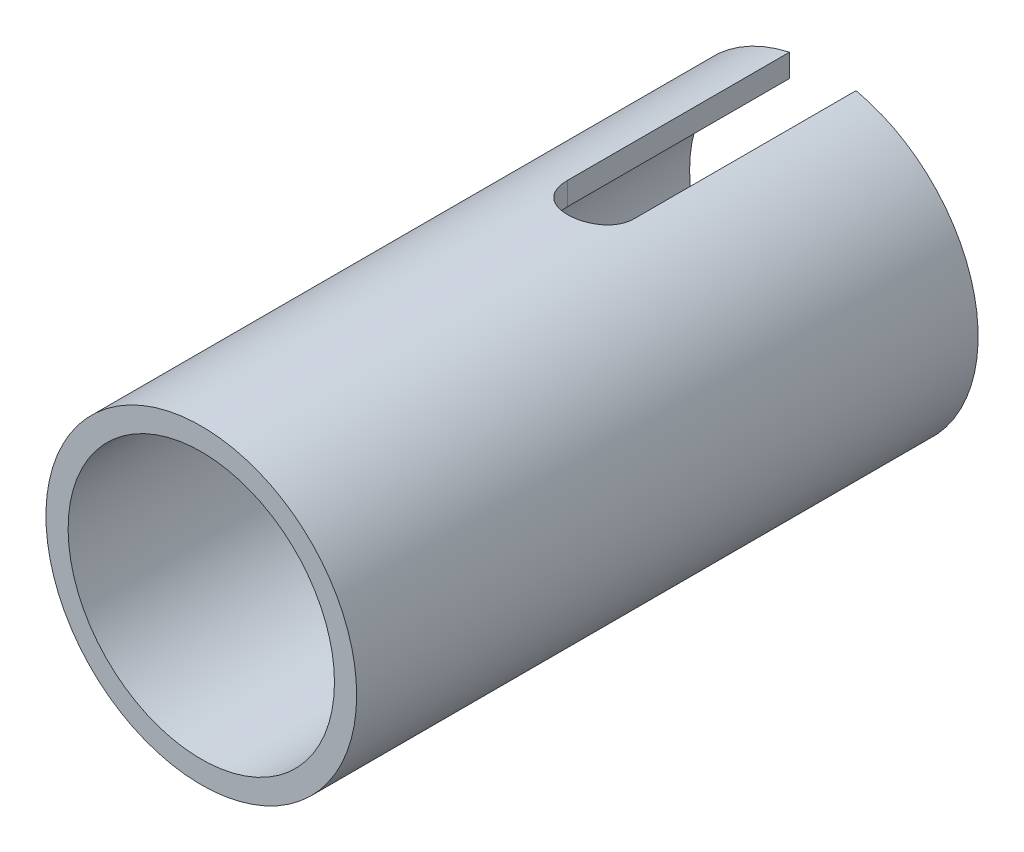
ISO-10303-21;
HEADER;
FILE_DESCRIPTION(('STEP AP214'),'2;1');
FILE_NAME('part.step','',(''),(''),'','','');
FILE_SCHEMA(('AUTOMOTIVE_DESIGN { 1 0 10303 214 1 1 1 1 }'));
ENDSEC;
DATA;
#1=APPLICATION_CONTEXT('core data for automotive mechanical design processes');
#2=APPLICATION_PROTOCOL_DEFINITION('international standard','automotive_design',2000,#1);
#3=PRODUCT_CONTEXT('',#1,'mechanical');
#4=PRODUCT('Part','Part','',(#3));
#5=PRODUCT_RELATED_PRODUCT_CATEGORY('part','',(#4));
#6=PRODUCT_DEFINITION_FORMATION('','',#4);
#7=PRODUCT_DEFINITION_CONTEXT('part definition',#1,'design');
#8=PRODUCT_DEFINITION('design','',#6,#7);
#9=PRODUCT_DEFINITION_SHAPE('','',#8);
#10=(LENGTH_UNIT() NAMED_UNIT(*) SI_UNIT(.MILLI.,.METRE.));
#11=(NAMED_UNIT(*) PLANE_ANGLE_UNIT() SI_UNIT($,.RADIAN.));
#12=(NAMED_UNIT(*) SI_UNIT($,.STERADIAN.) SOLID_ANGLE_UNIT());
#13=UNCERTAINTY_MEASURE_WITH_UNIT(LENGTH_MEASURE(1.E-05),#10,'distance_accuracy_value','');
#14=(GEOMETRIC_REPRESENTATION_CONTEXT(3) GLOBAL_UNCERTAINTY_ASSIGNED_CONTEXT((#13)) GLOBAL_UNIT_ASSIGNED_CONTEXT((#10,
#11,#12)) REPRESENTATION_CONTEXT('',''));
#15=CARTESIAN_POINT('',(0.,0.,0.));
#16=DIRECTION('',(0.,0.,1.));
#17=DIRECTION('',(1.,0.,0.));
#18=AXIS2_PLACEMENT_3D('',#15,#16,#17);
#19=CARTESIAN_POINT('',(0.,0.,-14.));
#20=DIRECTION('',(0.,0.,1.));
#21=DIRECTION('',(1.,0.,0.));
#22=AXIS2_PLACEMENT_3D('',#19,#20,#21);
#23=PLANE('',#22);
#24=DIRECTION('',(0.,1.,0.));
#25=VECTOR('',#24,1.);
#26=CARTESIAN_POINT('',(-1.5,0.,-14.));
#27=LINE('',#26,#25);
#28=CARTESIAN_POINT('',(-1.5,5.80947501931113,-14.));
#29=VERTEX_POINT('',#28);
#30=CARTESIAN_POINT('',(-1.5,6.83739716558867,-14.));
#31=VERTEX_POINT('',#30);
#32=EDGE_CURVE('E57',#29,#31,#27,.T.);
#33=ORIENTED_EDGE('',*,*,#32,.F.);
#34=CARTESIAN_POINT('',(0.,0.,-14.));
#35=DIRECTION('',(0.,0.,1.));
#36=DIRECTION('',(1.,0.,0.));
#37=AXIS2_PLACEMENT_3D('',#34,#35,#36);
#38=CIRCLE('',#37,6.);
#39=CARTESIAN_POINT('',(1.5,5.80947501931113,-14.));
#40=VERTEX_POINT('',#39);
#41=EDGE_CURVE('E88',#29,#40,#38,.T.);
#42=ORIENTED_EDGE('',*,*,#41,.T.);
#43=DIRECTION('',(0.,1.,0.));
#44=VECTOR('',#43,1.);
#45=CARTESIAN_POINT('',(1.5,0.,-14.));
#46=LINE('',#45,#44);
#47=CARTESIAN_POINT('',(1.5,6.83739716558867,-14.));
#48=VERTEX_POINT('',#47);
#49=EDGE_CURVE('E49',#40,#48,#46,.T.);
#50=ORIENTED_EDGE('',*,*,#49,.T.);
#51=CARTESIAN_POINT('',(0.,0.,-14.));
#52=DIRECTION('',(0.,0.,1.));
#53=DIRECTION('',(1.,0.,0.));
#54=AXIS2_PLACEMENT_3D('',#51,#52,#53);
#55=CIRCLE('',#54,7.);
#56=EDGE_CURVE('E86',#31,#48,#55,.T.);
#57=ORIENTED_EDGE('',*,*,#56,.F.);
#58=EDGE_LOOP('',(#33,#42,#50,#57));
#59=FACE_BOUND('',#58,.T.);
#60=ADVANCED_FACE('F33',(#59),#23,.F.);
#61=CARTESIAN_POINT('',(0.,0.,14.));
#62=DIRECTION('',(0.,0.,-1.));
#63=DIRECTION('',(-1.,0.,0.));
#64=AXIS2_PLACEMENT_3D('',#61,#62,#63);
#65=CYLINDRICAL_SURFACE('',#64,7.);
#66=CARTESIAN_POINT('',(0.,0.,14.));
#67=DIRECTION('',(0.,0.,1.));
#68=DIRECTION('',(1.,0.,0.));
#69=AXIS2_PLACEMENT_3D('',#66,#67,#68);
#70=CIRCLE('',#69,7.);
#71=CARTESIAN_POINT('',(7.,0.,14.));
#72=VERTEX_POINT('',#71);
#73=EDGE_CURVE('E91',#72,#72,#70,.T.);
#74=ORIENTED_EDGE('',*,*,#73,.F.);
#75=EDGE_LOOP('',(#74));
#76=FACE_BOUND('',#75,.T.);
#77=DIRECTION('',(0.,0.,-1.));
#78=VECTOR('',#77,1.);
#79=CARTESIAN_POINT('',(-1.5,6.83739716558867,14.));
#80=LINE('',#79,#78);
#81=CARTESIAN_POINT('',(-1.5,6.83739716558867,-4.));
#82=VERTEX_POINT('',#81);
#83=EDGE_CURVE('E90',#31,#82,#80,.F.);
#84=ORIENTED_EDGE('',*,*,#83,.F.);
#85=ORIENTED_EDGE('',*,*,#56,.T.);
#86=DIRECTION('',(0.,0.,-1.));
#87=VECTOR('',#86,1.);
#88=CARTESIAN_POINT('',(1.5,6.83739716558867,14.));
#89=LINE('',#88,#87);
#90=CARTESIAN_POINT('',(1.5,6.83739716558867,-4.));
#91=VERTEX_POINT('',#90);
#92=EDGE_CURVE('E74',#91,#48,#89,.T.);
#93=ORIENTED_EDGE('',*,*,#92,.F.);
#94=CARTESIAN_POINT('',(-1.5,6.83739716558867,-4.));
#95=CARTESIAN_POINT('',(-1.50000029732089,6.83739484329566,-3.95831678523298));
#96=CARTESIAN_POINT('',(-1.49826140658071,6.83777882435591,-3.91665403131256));
#97=CARTESIAN_POINT('',(-1.49132805084357,6.83929523701274,-3.8336363859717));
#98=CARTESIAN_POINT('',(-1.48613405334026,6.84042756735369,-3.79228145366679));
#99=CARTESIAN_POINT('',(-1.46543780681055,6.84490346593298,-3.66926930285053));
#100=CARTESIAN_POINT('',(-1.44482103342029,6.84932618278863,-3.58845147370675));
#101=CARTESIAN_POINT('',(-1.3905903999887,6.86054041036668,-3.4315270956149));
#102=CARTESIAN_POINT('',(-1.35697579844481,6.86733205623004,-3.3554208157396));
#103=CARTESIAN_POINT('',(-1.27773441574604,6.88251529148972,-3.20990079292933));
#104=CARTESIAN_POINT('',(-1.23210586634308,6.8909071163549,-3.14048803722327));
#105=CARTESIAN_POINT('',(-1.12935344969147,6.90849541544179,-3.00923864207543));
#106=CARTESIAN_POINT('',(-1.07207318514053,6.91770175451983,-2.94752579909368));
#107=CARTESIAN_POINT('',(-0.947974889192731,6.93579620720272,-2.8345008517585));
#108=CARTESIAN_POINT('',(-0.881155372688937,6.94468427098724,-2.78319036989993));
#109=CARTESIAN_POINT('',(-0.73904538052824,6.96124791167855,-2.69194325606053));
#110=CARTESIAN_POINT('',(-0.663676469106146,6.96891039531078,-2.65212620350719));
#111=CARTESIAN_POINT('',(-0.507129946630226,6.98204700344864,-2.58577091325486));
#112=CARTESIAN_POINT('',(-0.42595327127146,6.98752147953465,-2.55923054201752));
#113=CARTESIAN_POINT('',(-0.26138812941414,6.99559560634851,-2.52057024531131));
#114=CARTESIAN_POINT('',(-0.178051320316187,6.99823727344862,-2.50823935268556));
#115=CARTESIAN_POINT('',(-0.0104508848040283,7.00049363043298,-2.49768868443079));
#116=CARTESIAN_POINT('',(0.0738126602900054,7.00010858382522,-2.49946768038424));
#117=CARTESIAN_POINT('',(0.239417349879403,6.99638700149173,-2.51692899635186));
#118=CARTESIAN_POINT('',(0.32078374895878,6.99309880565581,-2.53238361513316));
#119=CARTESIAN_POINT('',(0.479740067564263,6.98399537089511,-2.57639490956332));
#120=CARTESIAN_POINT('',(0.55732985009482,6.9781800403752,-2.6049520601111));
#121=CARTESIAN_POINT('',(0.707168618927708,6.96459744432429,-2.67456195856455));
#122=CARTESIAN_POINT('',(0.779375811917164,6.95681662412837,-2.71570191500216));
#123=CARTESIAN_POINT('',(0.915942860799011,6.94015767254516,-2.80924362130109));
#124=CARTESIAN_POINT('',(0.980301920885987,6.93127943006207,-2.86164651174485));
#125=CARTESIAN_POINT('',(1.10069448348731,6.91319440083952,-2.97746092851556));
#126=CARTESIAN_POINT('',(1.15653715948799,6.90398459117831,-3.04107049675332));
#127=CARTESIAN_POINT('',(1.25681135832715,6.88643777134492,-3.1768663924243));
#128=CARTESIAN_POINT('',(1.30123974690007,6.87810100127342,-3.24905506766507));
#129=CARTESIAN_POINT('',(1.3775062481421,6.86323517651743,-3.40027102726539));
#130=CARTESIAN_POINT('',(1.40930236263766,6.85671217322863,-3.47932007632602));
#131=CARTESIAN_POINT('',(1.45906006728709,6.84629833307981,-3.64176182224441));
#132=CARTESIAN_POINT('',(1.47704225884158,6.8424035776398,-3.72514785205492));
#133=CARTESIAN_POINT('',(1.49189329044742,6.83917134563156,-3.84101322067716));
#134=CARTESIAN_POINT('',(1.4949342344042,6.83850683250701,-3.87275828161377));
#135=CARTESIAN_POINT('',(1.49898510369339,6.83762006876856,-3.93633072166705));
#136=CARTESIAN_POINT('',(1.49999840895604,6.83739708216771,-3.96815787509443));
#137=CARTESIAN_POINT('',(1.5,6.83739716558867,-4.));
#138=B_SPLINE_CURVE_WITH_KNOTS('',3,(#94,#95,#96,#97,#98,#99,#100,#101,#102,#103,#104,#105,#106,
#107,#108,#109,#110,#111,#112,#113,#114,#115,#116,#117,#118,#119,#120,#121,#122,#123,#124,#125,
#126,#127,#128,#129,#130,#131,#132,#133,#134,#135,#136,#137),.UNSPECIFIED.,.F.,.F.,(4,2,2,2,2,2,
2,2,2,2,2,2,2,2,2,2,2,2,2,2,2,4),(0.,0.124971263763367,0.249925621712149,0.499202862460446,
0.748494326122781,0.997822501764374,1.25074899410904,1.5037149060375,1.75922495548826,
2.01469393174161,2.26631902059305,2.51792220301497,2.76541336165448,3.01291349127569,
3.26216942567437,3.51145061379527,3.76568473601693,4.01998859431662,4.27513099287042,
4.52989214199009,4.6255313484217,4.72101099781213),.UNSPECIFIED.);
#139=EDGE_CURVE('E81',#82,#91,#138,.T.);
#140=ORIENTED_EDGE('',*,*,#139,.F.);
#141=EDGE_LOOP('',(#84,#85,#93,#140));
#142=FACE_BOUND('',#141,.T.);
#143=ADVANCED_FACE('F35',(#76,#142),#65,.T.);
#144=CARTESIAN_POINT('',(0.,0.,14.));
#145=DIRECTION('',(0.,0.,-1.));
#146=DIRECTION('',(-1.,0.,0.));
#147=AXIS2_PLACEMENT_3D('',#144,#145,#146);
#148=CYLINDRICAL_SURFACE('',#147,6.);
#149=CARTESIAN_POINT('',(0.,0.,14.));
#150=DIRECTION('',(0.,0.,1.));
#151=DIRECTION('',(1.,0.,0.));
#152=AXIS2_PLACEMENT_3D('',#149,#150,#151);
#153=CIRCLE('',#152,6.);
#154=CARTESIAN_POINT('',(6.,0.,14.));
#155=VERTEX_POINT('',#154);
#156=EDGE_CURVE('E92',#155,#155,#153,.T.);
#157=ORIENTED_EDGE('',*,*,#156,.T.);
#158=EDGE_LOOP('',(#157));
#159=FACE_BOUND('',#158,.T.);
#160=ORIENTED_EDGE('',*,*,#41,.F.);
#161=DIRECTION('',(0.,0.,-1.));
#162=VECTOR('',#161,1.);
#163=CARTESIAN_POINT('',(-1.5,5.80947501931113,14.));
#164=LINE('',#163,#162);
#165=CARTESIAN_POINT('',(-1.5,5.80947501931113,-4.));
#166=VERTEX_POINT('',#165);
#167=EDGE_CURVE('E11',#29,#166,#164,.F.);
#168=ORIENTED_EDGE('',*,*,#167,.T.);
#169=CARTESIAN_POINT('',(-1.5,5.80947501931113,-4.));
#170=CARTESIAN_POINT('',(-1.50000050624417,5.80947222870266,-3.95850552234019));
#171=CARTESIAN_POINT('',(-1.49827711106305,5.80992014924206,-3.91703160547266));
#172=CARTESIAN_POINT('',(-1.49140694309363,5.81168857161838,-3.83439394704465));
#173=CARTESIAN_POINT('',(-1.48626074635902,5.81300892662531,-3.79323015446936));
#174=CARTESIAN_POINT('',(-1.46576285907379,5.81822566458081,-3.67082024018673));
#175=CARTESIAN_POINT('',(-1.44535154275874,5.82337804723213,-3.59041529727669));
#176=CARTESIAN_POINT('',(-1.39169711437199,5.83643133882004,-3.43431298932705));
#177=CARTESIAN_POINT('',(-1.35845520813575,5.84433198946395,-3.35861518268071));
#178=CARTESIAN_POINT('',(-1.2801230670388,5.86198701707909,-3.21383282702901));
#179=CARTESIAN_POINT('',(-1.2350296550354,5.87174189093471,-3.14475005816355));
#180=CARTESIAN_POINT('',(-1.1332267077421,5.89224393597038,-3.01368417714085));
#181=CARTESIAN_POINT('',(-1.07630590317596,5.90300686543374,-2.95186767063172));
#182=CARTESIAN_POINT('',(-0.952913670774344,5.9241765659429,-2.83854686577594));
#183=CARTESIAN_POINT('',(-0.886440719218246,5.93458327983806,-2.78704421579809));
#184=CARTESIAN_POINT('',(-0.744685349102535,5.95404273424873,-2.69513349757203));
#185=CARTESIAN_POINT('',(-0.66929301050171,5.96307457022595,-2.65489015602404));
#186=CARTESIAN_POINT('',(-0.512553886264378,5.97858519375883,-2.58771289870494));
#187=CARTESIAN_POINT('',(-0.431208276124515,5.98506448372051,-2.56077636355025));
#188=CARTESIAN_POINT('',(-0.26661616278774,5.99462850007692,-2.52151151083385));
#189=CARTESIAN_POINT('',(-0.183441483004287,5.99777929351951,-2.50889849136577));
#190=CARTESIAN_POINT('',(-0.0160991635225196,6.00056157226223,-2.49774494268506));
#191=CARTESIAN_POINT('',(0.0680683500430581,6.00019349990167,-2.49920264471149));
#192=CARTESIAN_POINT('',(0.233028739458144,5.99602856048604,-2.51594494552818));
#193=CARTESIAN_POINT('',(0.313855052609782,5.99230798016041,-2.53092192489922));
#194=CARTESIAN_POINT('',(0.471808066626509,5.98194495954744,-2.57378301877412));
#195=CARTESIAN_POINT('',(0.548934603635981,5.97530238998334,-2.60166770435287));
#196=CARTESIAN_POINT('',(0.698110929036808,5.95972496642698,-2.66980192100598));
#197=CARTESIAN_POINT('',(0.770108444403371,5.95076990741333,-2.71016109134926));
#198=CARTESIAN_POINT('',(0.90641494684502,5.93153918312879,-2.8020146947502));
#199=CARTESIAN_POINT('',(0.970722773343432,5.92126331899798,-2.85351080537983));
#200=CARTESIAN_POINT('',(1.09165408456273,5.90018349034298,-2.96781836812197));
#201=CARTESIAN_POINT('',(1.14802365458119,5.88937275716528,-3.03089745480972));
#202=CARTESIAN_POINT('',(1.24945436277935,5.8686925242601,-3.1657448003916));
#203=CARTESIAN_POINT('',(1.29451240536759,5.8588232826449,-3.23751542992534));
#204=CARTESIAN_POINT('',(1.37220706392894,5.84111720379488,-3.38821839673565));
#205=CARTESIAN_POINT('',(1.4047755268309,5.83329159013705,-3.46718719734413));
#206=CARTESIAN_POINT('',(1.45605352777474,5.82070588210583,-3.62967539262743));
#207=CARTESIAN_POINT('',(1.4747837838182,5.81594120642153,-3.71318778272476));
#208=CARTESIAN_POINT('',(1.49085695272641,5.81182936022287,-3.83118607113835));
#209=CARTESIAN_POINT('',(1.49428618645006,5.8109478466629,-3.86487955481977));
#210=CARTESIAN_POINT('',(1.49885513654609,5.80977093733462,-3.93237668486398));
#211=CARTESIAN_POINT('',(1.49999855714407,5.80947459329192,-3.96618006393294));
#212=CARTESIAN_POINT('',(1.5,5.80947501931113,-4.));
#213=B_SPLINE_CURVE_WITH_KNOTS('',3,(#169,#170,#171,#172,#173,#174,#175,#176,#177,#178,#179,
#180,#181,#182,#183,#184,#185,#186,#187,#188,#189,#190,#191,#192,#193,#194,#195,#196,#197,#198,
#199,#200,#201,#202,#203,#204,#205,#206,#207,#208,#209,#210,#211,#212),.UNSPECIFIED.,.F.,.F.,(4,
2,2,2,2,2,2,2,2,2,2,2,2,2,2,2,2,2,2,2,2,4),(0.,0.124404795509654,0.248788659126977,
0.496844944620475,0.744877923137247,0.992977462090123,1.24596284614196,1.49898863030879,
1.75554280647352,2.01204646098636,2.26335722272987,2.51463639384958,2.76033818218913,
3.00605084213757,3.25398764175564,3.50196181446493,3.75662144301813,4.0113506877145,
4.26745080241601,4.52316671309978,4.62473773083971,4.72614401597506),.UNSPECIFIED.);
#214=CARTESIAN_POINT('',(1.5,5.80947501931113,-4.));
#215=VERTEX_POINT('',#214);
#216=EDGE_CURVE('E42',#166,#215,#213,.T.);
#217=ORIENTED_EDGE('',*,*,#216,.T.);
#218=DIRECTION('',(0.,0.,-1.));
#219=VECTOR('',#218,1.);
#220=CARTESIAN_POINT('',(1.5,5.80947501931113,14.));
#221=LINE('',#220,#219);
#222=EDGE_CURVE('E95',#215,#40,#221,.T.);
#223=ORIENTED_EDGE('',*,*,#222,.T.);
#224=EDGE_LOOP('',(#160,#168,#217,#223));
#225=FACE_BOUND('',#224,.T.);
#226=ADVANCED_FACE('F107',(#159,#225),#148,.F.);
#227=CARTESIAN_POINT('',(0.,0.,14.));
#228=DIRECTION('',(0.,0.,1.));
#229=DIRECTION('',(1.,0.,0.));
#230=AXIS2_PLACEMENT_3D('',#227,#228,#229);
#231=PLANE('',#230);
#232=ORIENTED_EDGE('',*,*,#73,.T.);
#233=EDGE_LOOP('',(#232));
#234=FACE_BOUND('',#233,.T.);
#235=ORIENTED_EDGE('',*,*,#156,.F.);
#236=EDGE_LOOP('',(#235));
#237=FACE_BOUND('',#236,.T.);
#238=ADVANCED_FACE('F131',(#234,#237),#231,.T.);
#239=CARTESIAN_POINT('',(-1.5,0.,-14.));
#240=DIRECTION('',(1.,0.,0.));
#241=DIRECTION('',(0.,0.,-1.));
#242=AXIS2_PLACEMENT_3D('',#239,#240,#241);
#243=PLANE('',#242);
#244=ORIENTED_EDGE('',*,*,#32,.T.);
#245=ORIENTED_EDGE('',*,*,#83,.T.);
#246=DIRECTION('',(0.,1.,0.));
#247=VECTOR('',#246,1.);
#248=CARTESIAN_POINT('',(-1.5,0.,-4.));
#249=LINE('',#248,#247);
#250=EDGE_CURVE('E126',#166,#82,#249,.T.);
#251=ORIENTED_EDGE('',*,*,#250,.F.);
#252=ORIENTED_EDGE('',*,*,#167,.F.);
#253=EDGE_LOOP('',(#244,#245,#251,#252));
#254=FACE_BOUND('',#253,.T.);
#255=ADVANCED_FACE('F115',(#254),#243,.T.);
#256=CARTESIAN_POINT('',(0.,0.,-4.));
#257=DIRECTION('',(0.,1.,0.));
#258=DIRECTION('',(0.,0.,1.));
#259=AXIS2_PLACEMENT_3D('',#256,#257,#258);
#260=CYLINDRICAL_SURFACE('',#259,1.5);
#261=ORIENTED_EDGE('',*,*,#250,.T.);
#262=ORIENTED_EDGE('',*,*,#139,.T.);
#263=DIRECTION('',(0.,1.,0.));
#264=VECTOR('',#263,1.);
#265=CARTESIAN_POINT('',(1.5,0.,-4.));
#266=LINE('',#265,#264);
#267=EDGE_CURVE('E77',#215,#91,#266,.T.);
#268=ORIENTED_EDGE('',*,*,#267,.F.);
#269=ORIENTED_EDGE('',*,*,#216,.F.);
#270=EDGE_LOOP('',(#261,#262,#268,#269));
#271=FACE_BOUND('',#270,.T.);
#272=ADVANCED_FACE('F111',(#271),#260,.F.);
#273=CARTESIAN_POINT('',(1.5,0.,-14.));
#274=DIRECTION('',(-1.,0.,0.));
#275=DIRECTION('',(0.,0.,1.));
#276=AXIS2_PLACEMENT_3D('',#273,#274,#275);
#277=PLANE('',#276);
#278=ORIENTED_EDGE('',*,*,#267,.T.);
#279=ORIENTED_EDGE('',*,*,#92,.T.);
#280=ORIENTED_EDGE('',*,*,#49,.F.);
#281=ORIENTED_EDGE('',*,*,#222,.F.);
#282=EDGE_LOOP('',(#278,#279,#280,#281));
#283=FACE_BOUND('',#282,.T.);
#284=ADVANCED_FACE('F75',(#283),#277,.T.);
#285=CLOSED_SHELL('',(#60,#143,#226,#238,#255,#272,#284));
#286=MANIFOLD_SOLID_BREP('B2',#285);
#287=ADVANCED_BREP_SHAPE_REPRESENTATION('',(#18,#286),#14);
#288=SHAPE_DEFINITION_REPRESENTATION(#9,#287);
ENDSEC;
END-ISO-10303-21;
